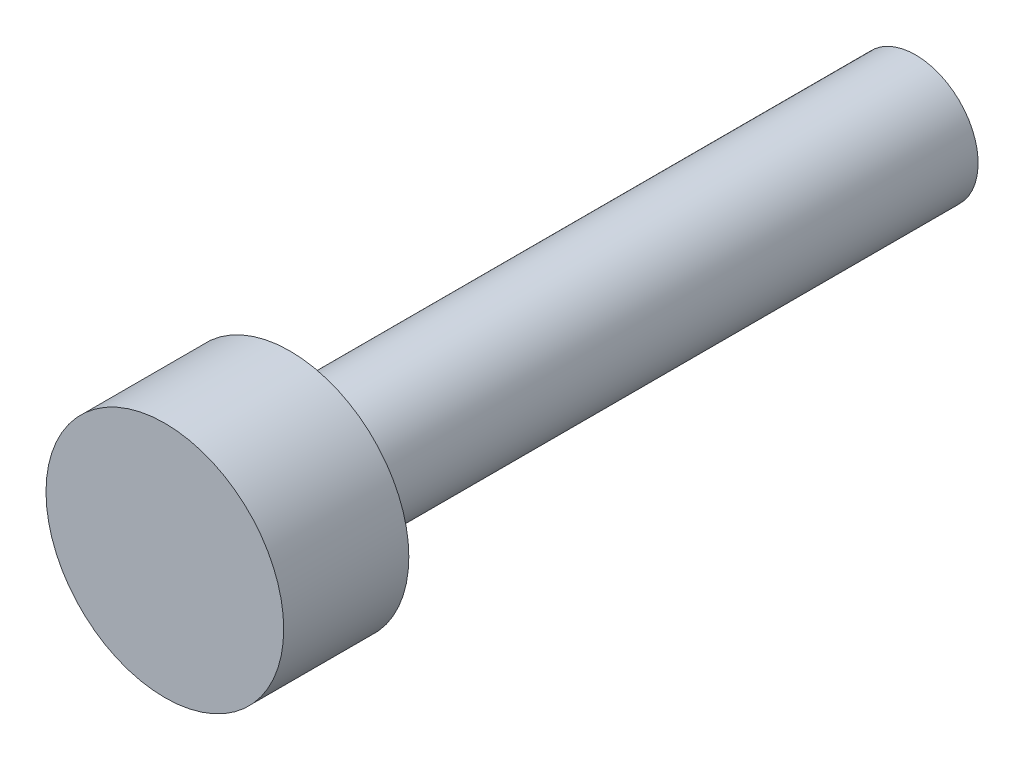
ISO-10303-21;
HEADER;
FILE_DESCRIPTION(('STEP AP214'),'2;1');
FILE_NAME('part.step','',(''),(''),'','','');
FILE_SCHEMA(('AUTOMOTIVE_DESIGN { 1 0 10303 214 1 1 1 1 }'));
ENDSEC;
DATA;
#1=APPLICATION_CONTEXT('core data for automotive mechanical design processes');
#2=APPLICATION_PROTOCOL_DEFINITION('international standard','automotive_design',2000,#1);
#3=PRODUCT_CONTEXT('',#1,'mechanical');
#4=PRODUCT('Part','Part','',(#3));
#5=PRODUCT_RELATED_PRODUCT_CATEGORY('part','',(#4));
#6=PRODUCT_DEFINITION_FORMATION('','',#4);
#7=PRODUCT_DEFINITION_CONTEXT('part definition',#1,'design');
#8=PRODUCT_DEFINITION('design','',#6,#7);
#9=PRODUCT_DEFINITION_SHAPE('','',#8);
#10=(LENGTH_UNIT() NAMED_UNIT(*) SI_UNIT(.MILLI.,.METRE.));
#11=(NAMED_UNIT(*) PLANE_ANGLE_UNIT() SI_UNIT($,.RADIAN.));
#12=(NAMED_UNIT(*) SI_UNIT($,.STERADIAN.) SOLID_ANGLE_UNIT());
#13=UNCERTAINTY_MEASURE_WITH_UNIT(LENGTH_MEASURE(1.E-05),#10,'distance_accuracy_value','');
#14=(GEOMETRIC_REPRESENTATION_CONTEXT(3) GLOBAL_UNCERTAINTY_ASSIGNED_CONTEXT((#13)) GLOBAL_UNIT_ASSIGNED_CONTEXT((#10,
#11,#12)) REPRESENTATION_CONTEXT('',''));
#15=CARTESIAN_POINT('',(0.,0.,0.));
#16=DIRECTION('',(0.,0.,1.));
#17=DIRECTION('',(1.,0.,0.));
#18=AXIS2_PLACEMENT_3D('',#15,#16,#17);
#19=CARTESIAN_POINT('',(0.,0.,4.));
#20=DIRECTION('',(0.,0.,-1.));
#21=DIRECTION('',(-1.,0.,0.));
#22=AXIS2_PLACEMENT_3D('',#19,#20,#21);
#23=CYLINDRICAL_SURFACE('',#22,3.8);
#24=CARTESIAN_POINT('',(0.,0.,4.));
#25=DIRECTION('',(0.,0.,1.));
#26=DIRECTION('',(1.,0.,0.));
#27=AXIS2_PLACEMENT_3D('',#24,#25,#26);
#28=CIRCLE('',#27,3.8);
#29=CARTESIAN_POINT('',(3.8,0.,4.));
#30=VERTEX_POINT('',#29);
#31=EDGE_CURVE('E44',#30,#30,#28,.T.);
#32=ORIENTED_EDGE('',*,*,#31,.F.);
#33=EDGE_LOOP('',(#32));
#34=FACE_BOUND('',#33,.T.);
#35=CARTESIAN_POINT('',(0.,0.,0.));
#36=DIRECTION('',(0.,0.,1.));
#37=DIRECTION('',(1.,0.,0.));
#38=AXIS2_PLACEMENT_3D('',#35,#36,#37);
#39=CIRCLE('',#38,3.8);
#40=CARTESIAN_POINT('',(3.8,0.,0.));
#41=VERTEX_POINT('',#40);
#42=EDGE_CURVE('E40',#41,#41,#39,.T.);
#43=ORIENTED_EDGE('',*,*,#42,.T.);
#44=EDGE_LOOP('',(#43));
#45=FACE_BOUND('',#44,.T.);
#46=ADVANCED_FACE('F37',(#34,#45),#23,.T.);
#47=CARTESIAN_POINT('',(0.,0.,4.));
#48=DIRECTION('',(0.,0.,1.));
#49=DIRECTION('',(1.,0.,0.));
#50=AXIS2_PLACEMENT_3D('',#47,#48,#49);
#51=PLANE('',#50);
#52=ORIENTED_EDGE('',*,*,#31,.T.);
#53=EDGE_LOOP('',(#52));
#54=FACE_BOUND('',#53,.T.);
#55=ADVANCED_FACE('F61',(#54),#51,.T.);
#56=CARTESIAN_POINT('',(0.,0.,0.));
#57=DIRECTION('',(0.,0.,1.));
#58=DIRECTION('',(1.,0.,0.));
#59=AXIS2_PLACEMENT_3D('',#56,#57,#58);
#60=PLANE('',#59);
#61=CARTESIAN_POINT('',(0.,0.,0.));
#62=DIRECTION('',(0.,0.,-1.));
#63=DIRECTION('',(-1.,0.,0.));
#64=AXIS2_PLACEMENT_3D('',#61,#62,#63);
#65=CIRCLE('',#64,2.);
#66=CARTESIAN_POINT('',(-2.,0.,0.));
#67=VERTEX_POINT('',#66);
#68=EDGE_CURVE('E10',#67,#67,#65,.T.);
#69=ORIENTED_EDGE('',*,*,#68,.F.);
#70=EDGE_LOOP('',(#69));
#71=FACE_BOUND('',#70,.T.);
#72=ORIENTED_EDGE('',*,*,#42,.F.);
#73=EDGE_LOOP('',(#72));
#74=FACE_BOUND('',#73,.T.);
#75=ADVANCED_FACE('F58',(#71,#74),#60,.F.);
#76=CARTESIAN_POINT('',(0.,0.,-20.));
#77=DIRECTION('',(0.,0.,1.));
#78=DIRECTION('',(1.,0.,0.));
#79=AXIS2_PLACEMENT_3D('',#76,#77,#78);
#80=CYLINDRICAL_SURFACE('',#79,2.);
#81=CARTESIAN_POINT('',(0.,0.,-20.));
#82=DIRECTION('',(0.,0.,-1.));
#83=DIRECTION('',(-1.,0.,0.));
#84=AXIS2_PLACEMENT_3D('',#81,#82,#83);
#85=CIRCLE('',#84,2.);
#86=CARTESIAN_POINT('',(-2.,0.,-20.));
#87=VERTEX_POINT('',#86);
#88=EDGE_CURVE('E50',#87,#87,#85,.T.);
#89=ORIENTED_EDGE('',*,*,#88,.F.);
#90=EDGE_LOOP('',(#89));
#91=FACE_BOUND('',#90,.T.);
#92=ORIENTED_EDGE('',*,*,#68,.T.);
#93=EDGE_LOOP('',(#92));
#94=FACE_BOUND('',#93,.T.);
#95=ADVANCED_FACE('F60',(#91,#94),#80,.T.);
#96=CARTESIAN_POINT('',(0.,0.,-20.));
#97=DIRECTION('',(0.,0.,-1.));
#98=DIRECTION('',(-1.,0.,0.));
#99=AXIS2_PLACEMENT_3D('',#96,#97,#98);
#100=PLANE('',#99);
#101=ORIENTED_EDGE('',*,*,#88,.T.);
#102=EDGE_LOOP('',(#101));
#103=FACE_BOUND('',#102,.T.);
#104=ADVANCED_FACE('F67',(#103),#100,.T.);
#105=CLOSED_SHELL('',(#46,#55,#75,#95,#104));
#106=MANIFOLD_SOLID_BREP('B2',#105);
#107=ADVANCED_BREP_SHAPE_REPRESENTATION('',(#18,#106),#14);
#108=SHAPE_DEFINITION_REPRESENTATION(#9,#107);
ENDSEC;
END-ISO-10303-21;
